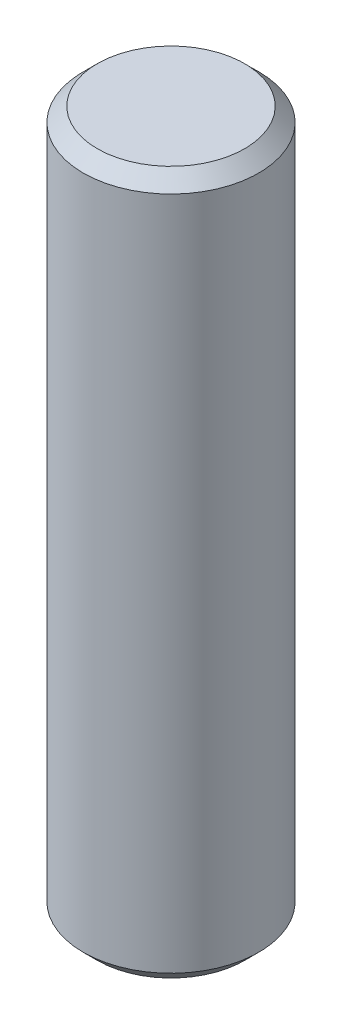
ISO-10303-21;
HEADER;
FILE_DESCRIPTION(('STEP AP214'),'2;1');
FILE_NAME('part.step','',(''),(''),'','','');
FILE_SCHEMA(('AUTOMOTIVE_DESIGN { 1 0 10303 214 1 1 1 1 }'));
ENDSEC;
DATA;
#1=APPLICATION_CONTEXT('core data for automotive mechanical design processes');
#2=APPLICATION_PROTOCOL_DEFINITION('international standard','automotive_design',2000,#1);
#3=PRODUCT_CONTEXT('',#1,'mechanical');
#4=PRODUCT('Part','Part','',(#3));
#5=PRODUCT_RELATED_PRODUCT_CATEGORY('part','',(#4));
#6=PRODUCT_DEFINITION_FORMATION('','',#4);
#7=PRODUCT_DEFINITION_CONTEXT('part definition',#1,'design');
#8=PRODUCT_DEFINITION('design','',#6,#7);
#9=PRODUCT_DEFINITION_SHAPE('','',#8);
#10=(LENGTH_UNIT() NAMED_UNIT(*) SI_UNIT(.MILLI.,.METRE.));
#11=(NAMED_UNIT(*) PLANE_ANGLE_UNIT() SI_UNIT($,.RADIAN.));
#12=(NAMED_UNIT(*) SI_UNIT($,.STERADIAN.) SOLID_ANGLE_UNIT());
#13=UNCERTAINTY_MEASURE_WITH_UNIT(LENGTH_MEASURE(1.E-05),#10,'distance_accuracy_value','');
#14=(GEOMETRIC_REPRESENTATION_CONTEXT(3) GLOBAL_UNCERTAINTY_ASSIGNED_CONTEXT((#13)) GLOBAL_UNIT_ASSIGNED_CONTEXT((#10,
#11,#12)) REPRESENTATION_CONTEXT('',''));
#15=CARTESIAN_POINT('',(0.,0.,0.));
#16=DIRECTION('',(0.,0.,1.));
#17=DIRECTION('',(1.,0.,0.));
#18=AXIS2_PLACEMENT_3D('',#15,#16,#17);
#19=CARTESIAN_POINT('',(-2.84219317506868E-11,0.508000000000005,0.));
#20=DIRECTION('',(0.,1.,0.));
#21=DIRECTION('',(0.,0.,1.));
#22=AXIS2_PLACEMENT_3D('',#19,#20,#21);
#23=CONICAL_SURFACE('',#22,3.17118999993587,0.785398163397449);
#24=CARTESIAN_POINT('',(-2.84219317506868E-11,2.84219317506868E-11,0.));
#25=DIRECTION('',(0.,1.,0.));
#26=DIRECTION('',(0.,0.,1.));
#27=AXIS2_PLACEMENT_3D('',#24,#25,#26);
#28=CIRCLE('',#27,2.66318999996429);
#29=CARTESIAN_POINT('',(-2.84219317506868E-11,2.84219317506868E-11,2.66318999996429));
#30=VERTEX_POINT('',#29);
#31=EDGE_CURVE('E47',#30,#30,#28,.T.);
#32=ORIENTED_EDGE('',*,*,#31,.T.);
#33=EDGE_LOOP('',(#32));
#34=FACE_BOUND('',#33,.T.);
#35=CARTESIAN_POINT('',(-2.84219317506868E-11,0.508000000000005,0.));
#36=DIRECTION('',(0.,1.,0.));
#37=DIRECTION('',(0.,0.,1.));
#38=AXIS2_PLACEMENT_3D('',#35,#36,#37);
#39=CIRCLE('',#38,3.17118999993587);
#40=CARTESIAN_POINT('',(-2.84219317506868E-11,0.508000000000005,3.17118999993587));
#41=VERTEX_POINT('',#40);
#42=EDGE_CURVE('E10',#41,#41,#39,.T.);
#43=ORIENTED_EDGE('',*,*,#42,.F.);
#44=EDGE_LOOP('',(#43));
#45=FACE_BOUND('',#44,.T.);
#46=ADVANCED_FACE('F33',(#34,#45),#23,.T.);
#47=CARTESIAN_POINT('',(-2.84219317506868E-11,2.84219317506868E-11,0.));
#48=DIRECTION('',(0.,1.,0.));
#49=DIRECTION('',(0.,0.,1.));
#50=AXIS2_PLACEMENT_3D('',#47,#48,#49);
#51=CYLINDRICAL_SURFACE('',#50,3.17118999993587);
#52=ORIENTED_EDGE('',*,*,#42,.T.);
#53=EDGE_LOOP('',(#52));
#54=FACE_BOUND('',#53,.T.);
#55=CARTESIAN_POINT('',(-2.84219317506868E-11,24.8920000000685,0.));
#56=DIRECTION('',(0.,1.,0.));
#57=DIRECTION('',(0.,0.,1.));
#58=AXIS2_PLACEMENT_3D('',#55,#56,#57);
#59=CIRCLE('',#58,3.17118999993588);
#60=CARTESIAN_POINT('',(-2.84219317506868E-11,24.8920000000685,3.17118999993588));
#61=VERTEX_POINT('',#60);
#62=EDGE_CURVE('E39',#61,#61,#59,.T.);
#63=ORIENTED_EDGE('',*,*,#62,.F.);
#64=EDGE_LOOP('',(#63));
#65=FACE_BOUND('',#64,.T.);
#66=ADVANCED_FACE('F66',(#54,#65),#51,.T.);
#67=CARTESIAN_POINT('',(-2.84219317506868E-11,25.4000000000237,0.));
#68=DIRECTION('',(0.,-1.,0.));
#69=DIRECTION('',(0.,0.,-1.));
#70=AXIS2_PLACEMENT_3D('',#67,#68,#69);
#71=CONICAL_SURFACE('',#70,2.6631899999807,0.785398163397448);
#72=ORIENTED_EDGE('',*,*,#62,.T.);
#73=EDGE_LOOP('',(#72));
#74=FACE_BOUND('',#73,.T.);
#75=CARTESIAN_POINT('',(-2.84219317506868E-11,25.4000000000237,0.));
#76=DIRECTION('',(0.,1.,0.));
#77=DIRECTION('',(0.,0.,1.));
#78=AXIS2_PLACEMENT_3D('',#75,#76,#77);
#79=CIRCLE('',#78,2.6631899999807);
#80=CARTESIAN_POINT('',(-2.84219317506868E-11,25.4000000000237,2.6631899999807));
#81=VERTEX_POINT('',#80);
#82=EDGE_CURVE('E43',#81,#81,#79,.T.);
#83=ORIENTED_EDGE('',*,*,#82,.F.);
#84=EDGE_LOOP('',(#83));
#85=FACE_BOUND('',#84,.T.);
#86=ADVANCED_FACE('F62',(#74,#85),#71,.T.);
#87=CARTESIAN_POINT('',(-2.84219317506868E-11,25.4000000000237,0.));
#88=DIRECTION('',(0.,1.,0.));
#89=DIRECTION('',(0.,0.,1.));
#90=AXIS2_PLACEMENT_3D('',#87,#88,#89);
#91=PLANE('',#90);
#92=ORIENTED_EDGE('',*,*,#82,.T.);
#93=EDGE_LOOP('',(#92));
#94=FACE_BOUND('',#93,.T.);
#95=ADVANCED_FACE('F57',(#94),#91,.T.);
#96=CARTESIAN_POINT('',(2.66318999993587,2.84219317506868E-11,0.));
#97=DIRECTION('',(0.,-1.,0.));
#98=DIRECTION('',(0.,0.,-1.));
#99=AXIS2_PLACEMENT_3D('',#96,#97,#98);
#100=PLANE('',#99);
#101=ORIENTED_EDGE('',*,*,#31,.F.);
#102=EDGE_LOOP('',(#101));
#103=FACE_BOUND('',#102,.T.);
#104=ADVANCED_FACE('F55',(#103),#100,.T.);
#105=CLOSED_SHELL('',(#46,#66,#86,#95,#104));
#106=MANIFOLD_SOLID_BREP('B2',#105);
#107=ADVANCED_BREP_SHAPE_REPRESENTATION('',(#18,#106),#14);
#108=SHAPE_DEFINITION_REPRESENTATION(#9,#107);
ENDSEC;
END-ISO-10303-21;
